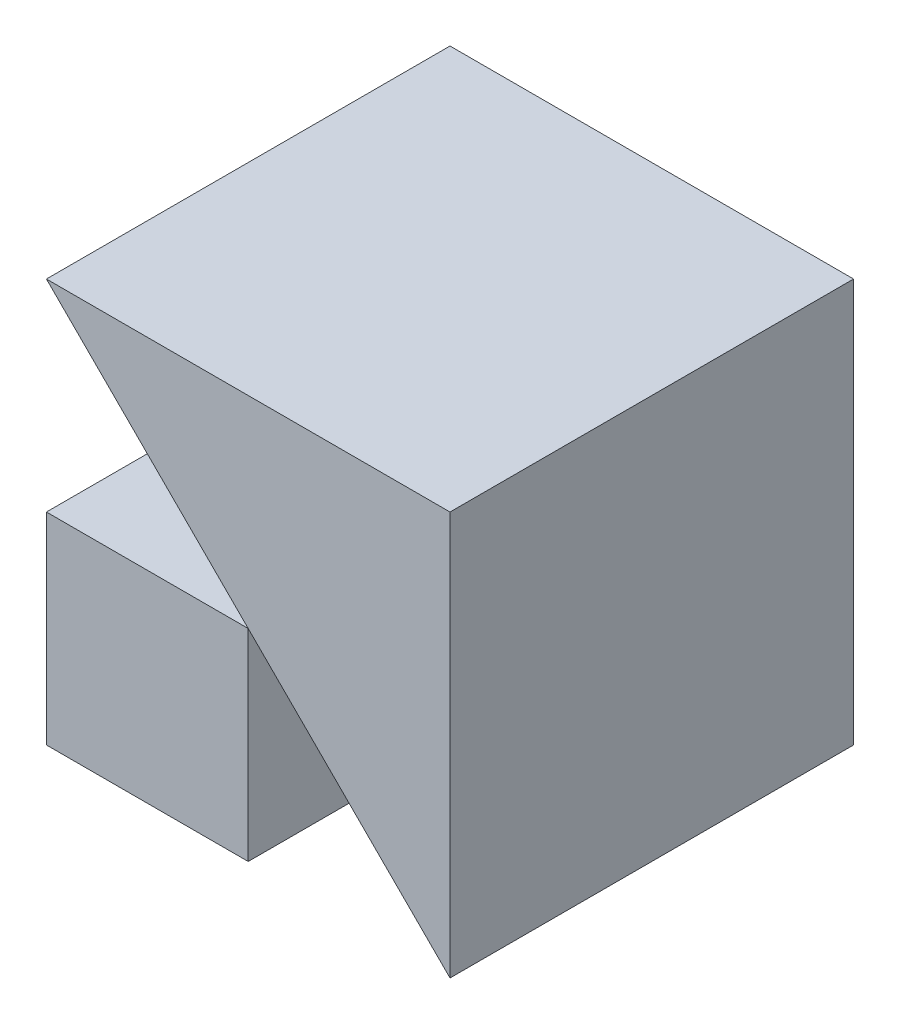
ISO-10303-21;
HEADER;
FILE_DESCRIPTION(('STEP AP214'),'2;1');
FILE_NAME('part.step','',(''),(''),'','','');
FILE_SCHEMA(('AUTOMOTIVE_DESIGN { 1 0 10303 214 1 1 1 1 }'));
ENDSEC;
DATA;
#1=APPLICATION_CONTEXT('core data for automotive mechanical design processes');
#2=APPLICATION_PROTOCOL_DEFINITION('international standard','automotive_design',2000,#1);
#3=PRODUCT_CONTEXT('',#1,'mechanical');
#4=PRODUCT('Part','Part','',(#3));
#5=PRODUCT_RELATED_PRODUCT_CATEGORY('part','',(#4));
#6=PRODUCT_DEFINITION_FORMATION('','',#4);
#7=PRODUCT_DEFINITION_CONTEXT('part definition',#1,'design');
#8=PRODUCT_DEFINITION('design','',#6,#7);
#9=PRODUCT_DEFINITION_SHAPE('','',#8);
#10=(LENGTH_UNIT() NAMED_UNIT(*) SI_UNIT(.MILLI.,.METRE.));
#11=(NAMED_UNIT(*) PLANE_ANGLE_UNIT() SI_UNIT($,.RADIAN.));
#12=(NAMED_UNIT(*) SI_UNIT($,.STERADIAN.) SOLID_ANGLE_UNIT());
#13=UNCERTAINTY_MEASURE_WITH_UNIT(LENGTH_MEASURE(1.E-05),#10,'distance_accuracy_value','');
#14=(GEOMETRIC_REPRESENTATION_CONTEXT(3) GLOBAL_UNCERTAINTY_ASSIGNED_CONTEXT((#13)) GLOBAL_UNIT_ASSIGNED_CONTEXT((#10,
#11,#12)) REPRESENTATION_CONTEXT('',''));
#15=CARTESIAN_POINT('',(0.,0.,0.));
#16=DIRECTION('',(0.,0.,1.));
#17=DIRECTION('',(1.,0.,0.));
#18=AXIS2_PLACEMENT_3D('',#15,#16,#17);
#19=CARTESIAN_POINT('',(4.,0.,4.));
#20=DIRECTION('',(1.,0.,0.));
#21=DIRECTION('',(0.,1.,0.));
#22=AXIS2_PLACEMENT_3D('',#19,#20,#21);
#23=PLANE('',#22);
#24=DIRECTION('',(0.,-1.,0.));
#25=VECTOR('',#24,1.);
#26=CARTESIAN_POINT('',(4.,0.,0.));
#27=LINE('',#26,#25);
#28=CARTESIAN_POINT('',(4.,0.,0.));
#29=VERTEX_POINT('',#28);
#30=CARTESIAN_POINT('',(4.,-4.,0.));
#31=VERTEX_POINT('',#30);
#32=EDGE_CURVE('E110',#29,#31,#27,.T.);
#33=ORIENTED_EDGE('',*,*,#32,.F.);
#34=DIRECTION('',(0.,0.,-1.));
#35=VECTOR('',#34,1.);
#36=CARTESIAN_POINT('',(4.,0.,4.));
#37=LINE('',#36,#35);
#38=CARTESIAN_POINT('',(4.,0.,4.));
#39=VERTEX_POINT('',#38);
#40=EDGE_CURVE('E13',#39,#29,#37,.T.);
#41=ORIENTED_EDGE('',*,*,#40,.F.);
#42=DIRECTION('',(0.,-1.,0.));
#43=VECTOR('',#42,1.);
#44=CARTESIAN_POINT('',(4.,0.,4.));
#45=LINE('',#44,#43);
#46=CARTESIAN_POINT('',(4.,-4.,4.));
#47=VERTEX_POINT('',#46);
#48=EDGE_CURVE('E108',#39,#47,#45,.T.);
#49=ORIENTED_EDGE('',*,*,#48,.T.);
#50=DIRECTION('',(0.,0.,-1.));
#51=VECTOR('',#50,1.);
#52=CARTESIAN_POINT('',(4.,-4.,4.));
#53=LINE('',#52,#51);
#54=EDGE_CURVE('E106',#47,#31,#53,.T.);
#55=ORIENTED_EDGE('',*,*,#54,.T.);
#56=EDGE_LOOP('',(#33,#41,#49,#55));
#57=FACE_BOUND('',#56,.T.);
#58=ADVANCED_FACE('F72',(#57),#23,.T.);
#59=CARTESIAN_POINT('',(0.,0.,4.));
#60=DIRECTION('',(0.,1.,0.));
#61=DIRECTION('',(0.,0.,1.));
#62=AXIS2_PLACEMENT_3D('',#59,#60,#61);
#63=PLANE('',#62);
#64=DIRECTION('',(1.,0.,0.));
#65=VECTOR('',#64,1.);
#66=CARTESIAN_POINT('',(0.,0.,0.));
#67=LINE('',#66,#65);
#68=CARTESIAN_POINT('',(0.,0.,0.));
#69=VERTEX_POINT('',#68);
#70=EDGE_CURVE('E128',#69,#29,#67,.T.);
#71=ORIENTED_EDGE('',*,*,#70,.F.);
#72=DIRECTION('',(0.,0.,-1.));
#73=VECTOR('',#72,1.);
#74=CARTESIAN_POINT('',(0.,0.,4.));
#75=LINE('',#74,#73);
#76=CARTESIAN_POINT('',(0.,0.,4.));
#77=VERTEX_POINT('',#76);
#78=EDGE_CURVE('E81',#77,#69,#75,.T.);
#79=ORIENTED_EDGE('',*,*,#78,.F.);
#80=DIRECTION('',(1.,0.,0.));
#81=VECTOR('',#80,1.);
#82=CARTESIAN_POINT('',(0.,0.,4.));
#83=LINE('',#82,#81);
#84=EDGE_CURVE('E116',#77,#39,#83,.T.);
#85=ORIENTED_EDGE('',*,*,#84,.T.);
#86=ORIENTED_EDGE('',*,*,#40,.T.);
#87=EDGE_LOOP('',(#71,#79,#85,#86));
#88=FACE_BOUND('',#87,.T.);
#89=ADVANCED_FACE('F120',(#88),#63,.T.);
#90=CARTESIAN_POINT('',(0.,0.,4.));
#91=DIRECTION('',(0.707106781186547,0.707106781186547,0.));
#92=DIRECTION('',(-0.707106781186548,0.707106781186548,0.));
#93=AXIS2_PLACEMENT_3D('',#90,#91,#92);
#94=PLANE('',#93);
#95=DIRECTION('',(0.707106781186548,-0.707106781186548,0.));
#96=VECTOR('',#95,1.);
#97=CARTESIAN_POINT('',(0.,0.,0.));
#98=LINE('',#97,#96);
#99=EDGE_CURVE('E118',#69,#31,#98,.T.);
#100=ORIENTED_EDGE('',*,*,#99,.T.);
#101=ORIENTED_EDGE('',*,*,#54,.F.);
#102=DIRECTION('',(0.707106781186548,-0.707106781186548,0.));
#103=VECTOR('',#102,1.);
#104=CARTESIAN_POINT('',(0.,0.,4.));
#105=LINE('',#104,#103);
#106=EDGE_CURVE('E89',#77,#47,#105,.T.);
#107=ORIENTED_EDGE('',*,*,#106,.F.);
#108=ORIENTED_EDGE('',*,*,#78,.T.);
#109=EDGE_LOOP('',(#100,#101,#107,#108));
#110=FACE_BOUND('',#109,.T.);
#111=ADVANCED_FACE('F135',(#110),#94,.F.);
#112=CARTESIAN_POINT('',(0.,0.,4.));
#113=DIRECTION('',(0.,0.,1.));
#114=DIRECTION('',(1.,0.,0.));
#115=AXIS2_PLACEMENT_3D('',#112,#113,#114);
#116=PLANE('',#115);
#117=ORIENTED_EDGE('',*,*,#48,.F.);
#118=ORIENTED_EDGE('',*,*,#84,.F.);
#119=ORIENTED_EDGE('',*,*,#106,.T.);
#120=EDGE_LOOP('',(#117,#118,#119));
#121=FACE_BOUND('',#120,.T.);
#122=ADVANCED_FACE('F115',(#121),#116,.T.);
#123=CARTESIAN_POINT('',(0.,0.,0.));
#124=DIRECTION('',(0.,0.,1.));
#125=DIRECTION('',(1.,0.,0.));
#126=AXIS2_PLACEMENT_3D('',#123,#124,#125);
#127=PLANE('',#126);
#128=ORIENTED_EDGE('',*,*,#32,.T.);
#129=ORIENTED_EDGE('',*,*,#99,.F.);
#130=ORIENTED_EDGE('',*,*,#70,.T.);
#131=EDGE_LOOP('',(#128,#129,#130));
#132=FACE_BOUND('',#131,.T.);
#133=ADVANCED_FACE('F137',(#132),#127,.F.);
#134=CLOSED_SHELL('',(#58,#89,#111,#122,#133));
#135=MANIFOLD_SOLID_BREP('B2',#134);
#136=CARTESIAN_POINT('',(0.,0.,4.));
#137=DIRECTION('',(1.,0.,0.));
#138=DIRECTION('',(0.,0.,-1.));
#139=AXIS2_PLACEMENT_3D('',#136,#137,#138);
#140=PLANE('',#139);
#141=DIRECTION('',(0.,-1.,0.));
#142=VECTOR('',#141,1.);
#143=CARTESIAN_POINT('',(0.,0.,0.));
#144=LINE('',#143,#142);
#145=CARTESIAN_POINT('',(0.,-1.99999999999999,0.));
#146=VERTEX_POINT('',#145);
#147=CARTESIAN_POINT('',(0.,-4.00000000000001,0.));
#148=VERTEX_POINT('',#147);
#149=EDGE_CURVE('E242',#146,#148,#144,.T.);
#150=ORIENTED_EDGE('',*,*,#149,.T.);
#151=DIRECTION('',(0.,0.,-1.));
#152=VECTOR('',#151,1.);
#153=CARTESIAN_POINT('',(0.,-4.00000000000001,4.));
#154=LINE('',#153,#152);
#155=CARTESIAN_POINT('',(0.,-4.00000000000001,4.));
#156=VERTEX_POINT('',#155);
#157=EDGE_CURVE('E70',#156,#148,#154,.T.);
#158=ORIENTED_EDGE('',*,*,#157,.F.);
#159=DIRECTION('',(0.,-1.,0.));
#160=VECTOR('',#159,1.);
#161=CARTESIAN_POINT('',(0.,0.,4.));
#162=LINE('',#161,#160);
#163=CARTESIAN_POINT('',(0.,-1.99999999999999,4.));
#164=VERTEX_POINT('',#163);
#165=EDGE_CURVE('E230',#164,#156,#162,.T.);
#166=ORIENTED_EDGE('',*,*,#165,.F.);
#167=DIRECTION('',(0.,0.,-1.));
#168=VECTOR('',#167,1.);
#169=CARTESIAN_POINT('',(0.,-1.99999999999999,4.));
#170=LINE('',#169,#168);
#171=EDGE_CURVE('E238',#164,#146,#170,.T.);
#172=ORIENTED_EDGE('',*,*,#171,.T.);
#173=EDGE_LOOP('',(#150,#158,#166,#172));
#174=FACE_BOUND('',#173,.T.);
#175=ADVANCED_FACE('F179',(#174),#140,.F.);
#176=CARTESIAN_POINT('',(0.,-4.00000000000001,4.));
#177=DIRECTION('',(0.,1.,0.));
#178=DIRECTION('',(0.,0.,1.));
#179=AXIS2_PLACEMENT_3D('',#176,#177,#178);
#180=PLANE('',#179);
#181=DIRECTION('',(1.,0.,0.));
#182=VECTOR('',#181,1.);
#183=CARTESIAN_POINT('',(0.,-4.00000000000001,0.));
#184=LINE('',#183,#182);
#185=CARTESIAN_POINT('',(2.00000000000001,-4.00000000000001,0.));
#186=VERTEX_POINT('',#185);
#187=EDGE_CURVE('E234',#148,#186,#184,.T.);
#188=ORIENTED_EDGE('',*,*,#187,.T.);
#189=DIRECTION('',(0.,0.,-1.));
#190=VECTOR('',#189,1.);
#191=CARTESIAN_POINT('',(2.00000000000001,-4.00000000000001,4.));
#192=LINE('',#191,#190);
#193=CARTESIAN_POINT('',(2.00000000000001,-4.00000000000001,4.));
#194=VERTEX_POINT('',#193);
#195=EDGE_CURVE('E187',#194,#186,#192,.T.);
#196=ORIENTED_EDGE('',*,*,#195,.F.);
#197=DIRECTION('',(1.,0.,0.));
#198=VECTOR('',#197,1.);
#199=CARTESIAN_POINT('',(0.,-4.00000000000001,4.));
#200=LINE('',#199,#198);
#201=EDGE_CURVE('E225',#156,#194,#200,.T.);
#202=ORIENTED_EDGE('',*,*,#201,.F.);
#203=ORIENTED_EDGE('',*,*,#157,.T.);
#204=EDGE_LOOP('',(#188,#196,#202,#203));
#205=FACE_BOUND('',#204,.T.);
#206=ADVANCED_FACE('F233',(#205),#180,.F.);
#207=CARTESIAN_POINT('',(1.99999999999999,0.,4.));
#208=DIRECTION('',(-1.,0.,0.));
#209=DIRECTION('',(0.,-1.,0.));
#210=AXIS2_PLACEMENT_3D('',#207,#208,#209);
#211=PLANE('',#210);
#212=DIRECTION('',(0.,1.,0.));
#213=VECTOR('',#212,1.);
#214=CARTESIAN_POINT('',(1.99999999999999,0.,0.));
#215=LINE('',#214,#213);
#216=CARTESIAN_POINT('',(2.,-2.,0.));
#217=VERTEX_POINT('',#216);
#218=EDGE_CURVE('E212',#186,#217,#215,.T.);
#219=ORIENTED_EDGE('',*,*,#218,.T.);
#220=DIRECTION('',(0.,0.,-1.));
#221=VECTOR('',#220,1.);
#222=CARTESIAN_POINT('',(2.,-2.,4.));
#223=LINE('',#222,#221);
#224=CARTESIAN_POINT('',(2.,-2.,4.));
#225=VERTEX_POINT('',#224);
#226=EDGE_CURVE('E235',#225,#217,#223,.T.);
#227=ORIENTED_EDGE('',*,*,#226,.F.);
#228=DIRECTION('',(0.,1.,0.));
#229=VECTOR('',#228,1.);
#230=CARTESIAN_POINT('',(1.99999999999999,0.,4.));
#231=LINE('',#230,#229);
#232=EDGE_CURVE('E228',#194,#225,#231,.T.);
#233=ORIENTED_EDGE('',*,*,#232,.F.);
#234=ORIENTED_EDGE('',*,*,#195,.T.);
#235=EDGE_LOOP('',(#219,#227,#233,#234));
#236=FACE_BOUND('',#235,.T.);
#237=ADVANCED_FACE('F236',(#236),#211,.F.);
#238=CARTESIAN_POINT('',(0.,-1.99999999999999,4.));
#239=DIRECTION('',(0.,-1.,0.));
#240=DIRECTION('',(1.,0.,0.));
#241=AXIS2_PLACEMENT_3D('',#238,#239,#240);
#242=PLANE('',#241);
#243=DIRECTION('',(-1.,0.,0.));
#244=VECTOR('',#243,1.);
#245=CARTESIAN_POINT('',(0.,-1.99999999999999,0.));
#246=LINE('',#245,#244);
#247=EDGE_CURVE('E218',#217,#146,#246,.T.);
#248=ORIENTED_EDGE('',*,*,#247,.T.);
#249=ORIENTED_EDGE('',*,*,#171,.F.);
#250=DIRECTION('',(-1.,0.,0.));
#251=VECTOR('',#250,1.);
#252=CARTESIAN_POINT('',(0.,-1.99999999999999,4.));
#253=LINE('',#252,#251);
#254=EDGE_CURVE('E195',#225,#164,#253,.T.);
#255=ORIENTED_EDGE('',*,*,#254,.F.);
#256=ORIENTED_EDGE('',*,*,#226,.T.);
#257=EDGE_LOOP('',(#248,#249,#255,#256));
#258=FACE_BOUND('',#257,.T.);
#259=ADVANCED_FACE('F249',(#258),#242,.F.);
#260=CARTESIAN_POINT('',(0.,0.,4.));
#261=DIRECTION('',(0.,0.,1.));
#262=DIRECTION('',(1.,0.,0.));
#263=AXIS2_PLACEMENT_3D('',#260,#261,#262);
#264=PLANE('',#263);
#265=ORIENTED_EDGE('',*,*,#165,.T.);
#266=ORIENTED_EDGE('',*,*,#201,.T.);
#267=ORIENTED_EDGE('',*,*,#232,.T.);
#268=ORIENTED_EDGE('',*,*,#254,.T.);
#269=EDGE_LOOP('',(#265,#266,#267,#268));
#270=FACE_BOUND('',#269,.T.);
#271=ADVANCED_FACE('F226',(#270),#264,.T.);
#272=CARTESIAN_POINT('',(0.,0.,0.));
#273=DIRECTION('',(0.,0.,1.));
#274=DIRECTION('',(1.,0.,0.));
#275=AXIS2_PLACEMENT_3D('',#272,#273,#274);
#276=PLANE('',#275);
#277=ORIENTED_EDGE('',*,*,#149,.F.);
#278=ORIENTED_EDGE('',*,*,#247,.F.);
#279=ORIENTED_EDGE('',*,*,#218,.F.);
#280=ORIENTED_EDGE('',*,*,#187,.F.);
#281=EDGE_LOOP('',(#277,#278,#279,#280));
#282=FACE_BOUND('',#281,.T.);
#283=ADVANCED_FACE('F252',(#282),#276,.F.);
#284=CLOSED_SHELL('',(#175,#206,#237,#259,#271,#283));
#285=MANIFOLD_SOLID_BREP('B7',#284);
#286=ADVANCED_BREP_SHAPE_REPRESENTATION('',(#18,#135,#285),#14);
#287=SHAPE_DEFINITION_REPRESENTATION(#9,#286);
ENDSEC;
END-ISO-10303-21;
